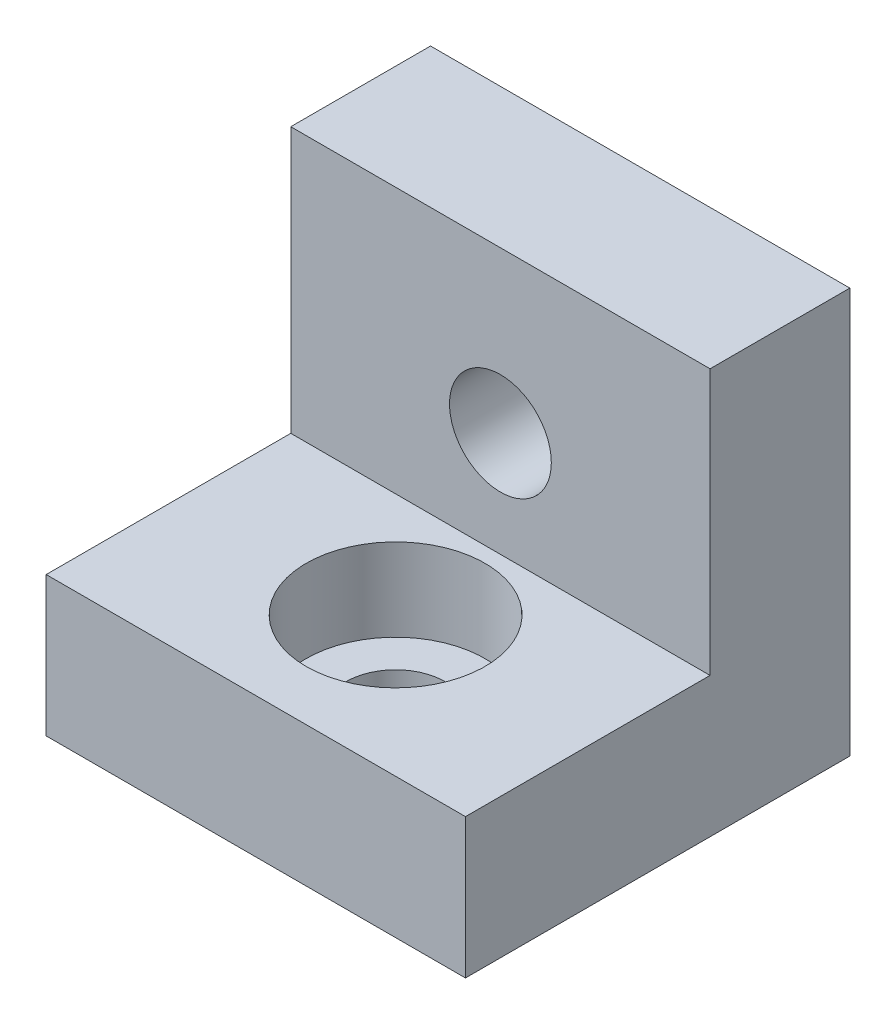
ISO-10303-21;
HEADER;
FILE_DESCRIPTION(('STEP AP214'),'2;1');
FILE_NAME('part.step','',(''),(''),'','','');
FILE_SCHEMA(('AUTOMOTIVE_DESIGN { 1 0 10303 214 1 1 1 1 }'));
ENDSEC;
DATA;
#1=APPLICATION_CONTEXT('core data for automotive mechanical design processes');
#2=APPLICATION_PROTOCOL_DEFINITION('international standard','automotive_design',2000,#1);
#3=PRODUCT_CONTEXT('',#1,'mechanical');
#4=PRODUCT('Part','Part','',(#3));
#5=PRODUCT_RELATED_PRODUCT_CATEGORY('part','',(#4));
#6=PRODUCT_DEFINITION_FORMATION('','',#4);
#7=PRODUCT_DEFINITION_CONTEXT('part definition',#1,'design');
#8=PRODUCT_DEFINITION('design','',#6,#7);
#9=PRODUCT_DEFINITION_SHAPE('','',#8);
#10=(LENGTH_UNIT() NAMED_UNIT(*) SI_UNIT(.MILLI.,.METRE.));
#11=(NAMED_UNIT(*) PLANE_ANGLE_UNIT() SI_UNIT($,.RADIAN.));
#12=(NAMED_UNIT(*) SI_UNIT($,.STERADIAN.) SOLID_ANGLE_UNIT());
#13=UNCERTAINTY_MEASURE_WITH_UNIT(LENGTH_MEASURE(1.E-05),#10,'distance_accuracy_value','');
#14=(GEOMETRIC_REPRESENTATION_CONTEXT(3) GLOBAL_UNCERTAINTY_ASSIGNED_CONTEXT((#13)) GLOBAL_UNIT_ASSIGNED_CONTEXT((#10,
#11,#12)) REPRESENTATION_CONTEXT('',''));
#15=CARTESIAN_POINT('',(0.,0.,0.));
#16=DIRECTION('',(0.,0.,1.));
#17=DIRECTION('',(1.,0.,0.));
#18=AXIS2_PLACEMENT_3D('',#15,#16,#17);
#19=CARTESIAN_POINT('',(-6.858,5.08,-10.795));
#20=DIRECTION('',(1.,0.,0.));
#21=DIRECTION('',(0.,0.,-1.));
#22=AXIS2_PLACEMENT_3D('',#19,#20,#21);
#23=PLANE('',#22);
#24=DIRECTION('',(0.,0.,1.));
#25=VECTOR('',#24,1.);
#26=CARTESIAN_POINT('',(-6.858,0.,-10.795));
#27=LINE('',#26,#25);
#28=CARTESIAN_POINT('',(-6.858,0.,-10.795));
#29=VERTEX_POINT('',#28);
#30=CARTESIAN_POINT('',(-6.858,0.,3.175));
#31=VERTEX_POINT('',#30);
#32=EDGE_CURVE('E94',#29,#31,#27,.T.);
#33=ORIENTED_EDGE('',*,*,#32,.T.);
#34=DIRECTION('',(0.,-1.,0.));
#35=VECTOR('',#34,1.);
#36=CARTESIAN_POINT('',(-6.858,5.08,3.175));
#37=LINE('',#36,#35);
#38=CARTESIAN_POINT('',(-6.858,5.08,3.175));
#39=VERTEX_POINT('',#38);
#40=EDGE_CURVE('E11',#39,#31,#37,.T.);
#41=ORIENTED_EDGE('',*,*,#40,.F.);
#42=DIRECTION('',(0.,0.,1.));
#43=VECTOR('',#42,1.);
#44=CARTESIAN_POINT('',(-6.858,5.08,-10.795));
#45=LINE('',#44,#43);
#46=CARTESIAN_POINT('',(-6.858,5.08,-5.715));
#47=VERTEX_POINT('',#46);
#48=EDGE_CURVE('E87',#47,#39,#45,.T.);
#49=ORIENTED_EDGE('',*,*,#48,.F.);
#50=DIRECTION('',(0.,-1.,0.));
#51=VECTOR('',#50,1.);
#52=CARTESIAN_POINT('',(-6.858,14.732,-5.715));
#53=LINE('',#52,#51);
#54=CARTESIAN_POINT('',(-6.858,14.732,-5.715));
#55=VERTEX_POINT('',#54);
#56=EDGE_CURVE('E102',#55,#47,#53,.T.);
#57=ORIENTED_EDGE('',*,*,#56,.F.);
#58=DIRECTION('',(0.,0.,1.));
#59=VECTOR('',#58,1.);
#60=CARTESIAN_POINT('',(-6.858,14.732,-10.795));
#61=LINE('',#60,#59);
#62=CARTESIAN_POINT('',(-6.858,14.732,-10.795));
#63=VERTEX_POINT('',#62);
#64=EDGE_CURVE('E97',#63,#55,#61,.T.);
#65=ORIENTED_EDGE('',*,*,#64,.F.);
#66=DIRECTION('',(0.,-1.,0.));
#67=VECTOR('',#66,1.);
#68=CARTESIAN_POINT('',(-6.858,5.08,-10.795));
#69=LINE('',#68,#67);
#70=EDGE_CURVE('E80',#63,#29,#69,.T.);
#71=ORIENTED_EDGE('',*,*,#70,.T.);
#72=EDGE_LOOP('',(#33,#41,#49,#57,#65,#71));
#73=FACE_BOUND('',#72,.T.);
#74=ADVANCED_FACE('F35',(#73),#23,.F.);
#75=CARTESIAN_POINT('',(-6.858,5.08,3.175));
#76=DIRECTION('',(0.,0.,-1.));
#77=DIRECTION('',(-1.,0.,0.));
#78=AXIS2_PLACEMENT_3D('',#75,#76,#77);
#79=PLANE('',#78);
#80=DIRECTION('',(1.,0.,0.));
#81=VECTOR('',#80,1.);
#82=CARTESIAN_POINT('',(-6.858,0.,3.175));
#83=LINE('',#82,#81);
#84=CARTESIAN_POINT('',(8.382,0.,3.175));
#85=VERTEX_POINT('',#84);
#86=EDGE_CURVE('E101',#31,#85,#83,.T.);
#87=ORIENTED_EDGE('',*,*,#86,.T.);
#88=DIRECTION('',(0.,-1.,0.));
#89=VECTOR('',#88,1.);
#90=CARTESIAN_POINT('',(8.382,5.08,3.175));
#91=LINE('',#90,#89);
#92=CARTESIAN_POINT('',(8.382,5.08,3.175));
#93=VERTEX_POINT('',#92);
#94=EDGE_CURVE('E43',#93,#85,#91,.T.);
#95=ORIENTED_EDGE('',*,*,#94,.F.);
#96=DIRECTION('',(1.,0.,0.));
#97=VECTOR('',#96,1.);
#98=CARTESIAN_POINT('',(-6.858,5.08,3.175));
#99=LINE('',#98,#97);
#100=EDGE_CURVE('E56',#39,#93,#99,.T.);
#101=ORIENTED_EDGE('',*,*,#100,.F.);
#102=ORIENTED_EDGE('',*,*,#40,.T.);
#103=EDGE_LOOP('',(#87,#95,#101,#102));
#104=FACE_BOUND('',#103,.T.);
#105=ADVANCED_FACE('F119',(#104),#79,.F.);
#106=CARTESIAN_POINT('',(8.382,5.08,-10.795));
#107=DIRECTION('',(-1.,0.,0.));
#108=DIRECTION('',(0.,0.,1.));
#109=AXIS2_PLACEMENT_3D('',#106,#107,#108);
#110=PLANE('',#109);
#111=DIRECTION('',(0.,0.,-1.));
#112=VECTOR('',#111,1.);
#113=CARTESIAN_POINT('',(8.382,0.,-10.795));
#114=LINE('',#113,#112);
#115=CARTESIAN_POINT('',(8.382,0.,-10.795));
#116=VERTEX_POINT('',#115);
#117=EDGE_CURVE('E88',#85,#116,#114,.T.);
#118=ORIENTED_EDGE('',*,*,#117,.T.);
#119=DIRECTION('',(0.,-1.,0.));
#120=VECTOR('',#119,1.);
#121=CARTESIAN_POINT('',(8.382,5.08,-10.795));
#122=LINE('',#121,#120);
#123=CARTESIAN_POINT('',(8.382,14.732,-10.795));
#124=VERTEX_POINT('',#123);
#125=EDGE_CURVE('E83',#124,#116,#122,.T.);
#126=ORIENTED_EDGE('',*,*,#125,.F.);
#127=DIRECTION('',(0.,0.,-1.));
#128=VECTOR('',#127,1.);
#129=CARTESIAN_POINT('',(8.382,14.732,-10.795));
#130=LINE('',#129,#128);
#131=CARTESIAN_POINT('',(8.382,14.732,-5.715));
#132=VERTEX_POINT('',#131);
#133=EDGE_CURVE('E134',#132,#124,#130,.T.);
#134=ORIENTED_EDGE('',*,*,#133,.F.);
#135=DIRECTION('',(0.,-1.,0.));
#136=VECTOR('',#135,1.);
#137=CARTESIAN_POINT('',(8.382,14.732,-5.715));
#138=LINE('',#137,#136);
#139=CARTESIAN_POINT('',(8.382,5.08,-5.715));
#140=VERTEX_POINT('',#139);
#141=EDGE_CURVE('E106',#132,#140,#138,.T.);
#142=ORIENTED_EDGE('',*,*,#141,.T.);
#143=DIRECTION('',(0.,0.,-1.));
#144=VECTOR('',#143,1.);
#145=CARTESIAN_POINT('',(8.382,5.08,-10.795));
#146=LINE('',#145,#144);
#147=EDGE_CURVE('E98',#93,#140,#146,.T.);
#148=ORIENTED_EDGE('',*,*,#147,.F.);
#149=ORIENTED_EDGE('',*,*,#94,.T.);
#150=EDGE_LOOP('',(#118,#126,#134,#142,#148,#149));
#151=FACE_BOUND('',#150,.T.);
#152=ADVANCED_FACE('F116',(#151),#110,.F.);
#153=CARTESIAN_POINT('',(-6.858,5.08,-10.795));
#154=DIRECTION('',(0.,0.,1.));
#155=DIRECTION('',(1.,0.,0.));
#156=AXIS2_PLACEMENT_3D('',#153,#154,#155);
#157=PLANE('',#156);
#158=CARTESIAN_POINT('',(0.762000000000001,8.89,-10.795));
#159=DIRECTION('',(0.,0.,1.));
#160=DIRECTION('',(1.,0.,0.));
#161=AXIS2_PLACEMENT_3D('',#158,#159,#160);
#162=CIRCLE('',#161,1.84999999999999);
#163=CARTESIAN_POINT('',(2.61199999999999,8.89,-10.795));
#164=VERTEX_POINT('',#163);
#165=EDGE_CURVE('E139',#164,#164,#162,.T.);
#166=ORIENTED_EDGE('',*,*,#165,.T.);
#167=EDGE_LOOP('',(#166));
#168=FACE_BOUND('',#167,.T.);
#169=DIRECTION('',(-1.,0.,0.));
#170=VECTOR('',#169,1.);
#171=CARTESIAN_POINT('',(-6.858,0.,-10.795));
#172=LINE('',#171,#170);
#173=EDGE_CURVE('E76',#116,#29,#172,.T.);
#174=ORIENTED_EDGE('',*,*,#173,.T.);
#175=ORIENTED_EDGE('',*,*,#70,.F.);
#176=DIRECTION('',(-1.,0.,0.));
#177=VECTOR('',#176,1.);
#178=CARTESIAN_POINT('',(-6.858,14.732,-10.795));
#179=LINE('',#178,#177);
#180=EDGE_CURVE('E137',#124,#63,#179,.T.);
#181=ORIENTED_EDGE('',*,*,#180,.F.);
#182=ORIENTED_EDGE('',*,*,#125,.T.);
#183=EDGE_LOOP('',(#174,#175,#181,#182));
#184=FACE_BOUND('',#183,.T.);
#185=ADVANCED_FACE('F78',(#168,#184),#157,.F.);
#186=CARTESIAN_POINT('',(0.,5.08,0.));
#187=DIRECTION('',(0.,1.,0.));
#188=DIRECTION('',(0.,0.,1.));
#189=AXIS2_PLACEMENT_3D('',#186,#187,#188);
#190=PLANE('',#189);
#191=CARTESIAN_POINT('',(0.762000000000001,5.08,-1.905));
#192=DIRECTION('',(0.,1.,0.));
#193=DIRECTION('',(0.,0.,1.));
#194=AXIS2_PLACEMENT_3D('',#191,#192,#193);
#195=CIRCLE('',#194,3.25);
#196=CARTESIAN_POINT('',(0.762000000000001,5.08,1.345));
#197=VERTEX_POINT('',#196);
#198=EDGE_CURVE('E253',#197,#197,#195,.T.);
#199=ORIENTED_EDGE('',*,*,#198,.F.);
#200=EDGE_LOOP('',(#199));
#201=FACE_BOUND('',#200,.T.);
#202=DIRECTION('',(1.,0.,0.));
#203=VECTOR('',#202,1.);
#204=CARTESIAN_POINT('',(-6.858,5.08,-5.715));
#205=LINE('',#204,#203);
#206=EDGE_CURVE('E50',#47,#140,#205,.T.);
#207=ORIENTED_EDGE('',*,*,#206,.F.);
#208=ORIENTED_EDGE('',*,*,#48,.T.);
#209=ORIENTED_EDGE('',*,*,#100,.T.);
#210=ORIENTED_EDGE('',*,*,#147,.T.);
#211=EDGE_LOOP('',(#207,#208,#209,#210));
#212=FACE_BOUND('',#211,.T.);
#213=ADVANCED_FACE('F146',(#201,#212),#190,.T.);
#214=CARTESIAN_POINT('',(0.,0.,0.));
#215=DIRECTION('',(0.,1.,0.));
#216=DIRECTION('',(0.,0.,1.));
#217=AXIS2_PLACEMENT_3D('',#214,#215,#216);
#218=PLANE('',#217);
#219=CARTESIAN_POINT('',(0.762000000000001,0.,-1.905));
#220=DIRECTION('',(0.,1.,0.));
#221=DIRECTION('',(0.,0.,1.));
#222=AXIS2_PLACEMENT_3D('',#219,#220,#221);
#223=CIRCLE('',#222,1.8);
#224=CARTESIAN_POINT('',(0.762000000000001,0.,-0.105000000000005));
#225=VERTEX_POINT('',#224);
#226=EDGE_CURVE('E38',#225,#225,#223,.T.);
#227=ORIENTED_EDGE('',*,*,#226,.T.);
#228=EDGE_LOOP('',(#227));
#229=FACE_BOUND('',#228,.T.);
#230=ORIENTED_EDGE('',*,*,#32,.F.);
#231=ORIENTED_EDGE('',*,*,#173,.F.);
#232=ORIENTED_EDGE('',*,*,#117,.F.);
#233=ORIENTED_EDGE('',*,*,#86,.F.);
#234=EDGE_LOOP('',(#230,#231,#232,#233));
#235=FACE_BOUND('',#234,.T.);
#236=ADVANCED_FACE('F100',(#229,#235),#218,.F.);
#237=CARTESIAN_POINT('',(-6.858,14.732,-5.715));
#238=DIRECTION('',(0.,0.,-1.));
#239=DIRECTION('',(-1.,0.,0.));
#240=AXIS2_PLACEMENT_3D('',#237,#238,#239);
#241=PLANE('',#240);
#242=CARTESIAN_POINT('',(0.762000000000001,8.89,-5.715));
#243=DIRECTION('',(0.,0.,1.));
#244=DIRECTION('',(1.,0.,0.));
#245=AXIS2_PLACEMENT_3D('',#242,#243,#244);
#246=CIRCLE('',#245,1.84999999999999);
#247=CARTESIAN_POINT('',(2.61199999999999,8.89,-5.715));
#248=VERTEX_POINT('',#247);
#249=EDGE_CURVE('E259',#248,#248,#246,.T.);
#250=ORIENTED_EDGE('',*,*,#249,.F.);
#251=EDGE_LOOP('',(#250));
#252=FACE_BOUND('',#251,.T.);
#253=ORIENTED_EDGE('',*,*,#206,.T.);
#254=ORIENTED_EDGE('',*,*,#141,.F.);
#255=DIRECTION('',(1.,0.,0.));
#256=VECTOR('',#255,1.);
#257=CARTESIAN_POINT('',(-6.858,14.732,-5.715));
#258=LINE('',#257,#256);
#259=EDGE_CURVE('E128',#55,#132,#258,.T.);
#260=ORIENTED_EDGE('',*,*,#259,.F.);
#261=ORIENTED_EDGE('',*,*,#56,.T.);
#262=EDGE_LOOP('',(#253,#254,#260,#261));
#263=FACE_BOUND('',#262,.T.);
#264=ADVANCED_FACE('F124',(#252,#263),#241,.F.);
#265=CARTESIAN_POINT('',(0.,14.732,0.));
#266=DIRECTION('',(0.,1.,0.));
#267=DIRECTION('',(0.,0.,1.));
#268=AXIS2_PLACEMENT_3D('',#265,#266,#267);
#269=PLANE('',#268);
#270=ORIENTED_EDGE('',*,*,#64,.T.);
#271=ORIENTED_EDGE('',*,*,#259,.T.);
#272=ORIENTED_EDGE('',*,*,#133,.T.);
#273=ORIENTED_EDGE('',*,*,#180,.T.);
#274=EDGE_LOOP('',(#270,#271,#272,#273));
#275=FACE_BOUND('',#274,.T.);
#276=ADVANCED_FACE('F136',(#275),#269,.T.);
#277=CARTESIAN_POINT('',(0.762000000000001,8.89,-5.715));
#278=DIRECTION('',(0.,0.,1.));
#279=DIRECTION('',(1.,0.,0.));
#280=AXIS2_PLACEMENT_3D('',#277,#278,#279);
#281=CYLINDRICAL_SURFACE('',#280,1.84999999999999);
#282=ORIENTED_EDGE('',*,*,#249,.T.);
#283=EDGE_LOOP('',(#282));
#284=FACE_BOUND('',#283,.T.);
#285=ORIENTED_EDGE('',*,*,#165,.F.);
#286=EDGE_LOOP('',(#285));
#287=FACE_BOUND('',#286,.T.);
#288=ADVANCED_FACE('F196',(#284,#287),#281,.F.);
#289=CARTESIAN_POINT('',(0.762000000000001,5.08,-1.905));
#290=DIRECTION('',(0.,1.,0.));
#291=DIRECTION('',(0.,0.,1.));
#292=AXIS2_PLACEMENT_3D('',#289,#290,#291);
#293=CYLINDRICAL_SURFACE('',#292,1.8);
#294=CARTESIAN_POINT('',(0.762000000000001,2.08,-1.905));
#295=DIRECTION('',(0.,1.,0.));
#296=DIRECTION('',(0.,0.,1.));
#297=AXIS2_PLACEMENT_3D('',#294,#295,#296);
#298=CIRCLE('',#297,1.8);
#299=CARTESIAN_POINT('',(0.762000000000001,2.08,-0.105000000000004));
#300=VERTEX_POINT('',#299);
#301=EDGE_CURVE('E255',#300,#300,#298,.T.);
#302=ORIENTED_EDGE('',*,*,#301,.T.);
#303=EDGE_LOOP('',(#302));
#304=FACE_BOUND('',#303,.T.);
#305=ORIENTED_EDGE('',*,*,#226,.F.);
#306=EDGE_LOOP('',(#305));
#307=FACE_BOUND('',#306,.T.);
#308=ADVANCED_FACE('F200',(#304,#307),#293,.F.);
#309=CARTESIAN_POINT('',(2.562,2.08,-1.905));
#310=DIRECTION('',(0.,-1.,0.));
#311=DIRECTION('',(0.,0.,-1.));
#312=AXIS2_PLACEMENT_3D('',#309,#310,#311);
#313=PLANE('',#312);
#314=ORIENTED_EDGE('',*,*,#301,.F.);
#315=EDGE_LOOP('',(#314));
#316=FACE_BOUND('',#315,.T.);
#317=CARTESIAN_POINT('',(0.762000000000001,2.08,-1.905));
#318=DIRECTION('',(0.,1.,0.));
#319=DIRECTION('',(0.,0.,1.));
#320=AXIS2_PLACEMENT_3D('',#317,#318,#319);
#321=CIRCLE('',#320,3.25);
#322=CARTESIAN_POINT('',(0.762000000000001,2.08,1.345));
#323=VERTEX_POINT('',#322);
#324=EDGE_CURVE('E251',#323,#323,#321,.T.);
#325=ORIENTED_EDGE('',*,*,#324,.T.);
#326=EDGE_LOOP('',(#325));
#327=FACE_BOUND('',#326,.T.);
#328=ADVANCED_FACE('F222',(#316,#327),#313,.F.);
#329=CARTESIAN_POINT('',(0.762000000000001,5.08,-1.905));
#330=DIRECTION('',(0.,1.,0.));
#331=DIRECTION('',(0.,0.,1.));
#332=AXIS2_PLACEMENT_3D('',#329,#330,#331);
#333=CYLINDRICAL_SURFACE('',#332,3.25);
#334=ORIENTED_EDGE('',*,*,#324,.F.);
#335=EDGE_LOOP('',(#334));
#336=FACE_BOUND('',#335,.T.);
#337=ORIENTED_EDGE('',*,*,#198,.T.);
#338=EDGE_LOOP('',(#337));
#339=FACE_BOUND('',#338,.T.);
#340=ADVANCED_FACE('F232',(#336,#339),#333,.F.);
#341=CLOSED_SHELL('',(#74,#105,#152,#185,#213,#236,#264,#276,#288,#308,#328,#340));
#342=MANIFOLD_SOLID_BREP('B2',#341);
#343=ADVANCED_BREP_SHAPE_REPRESENTATION('',(#18,#342),#14);
#344=SHAPE_DEFINITION_REPRESENTATION(#9,#343);
ENDSEC;
END-ISO-10303-21;
